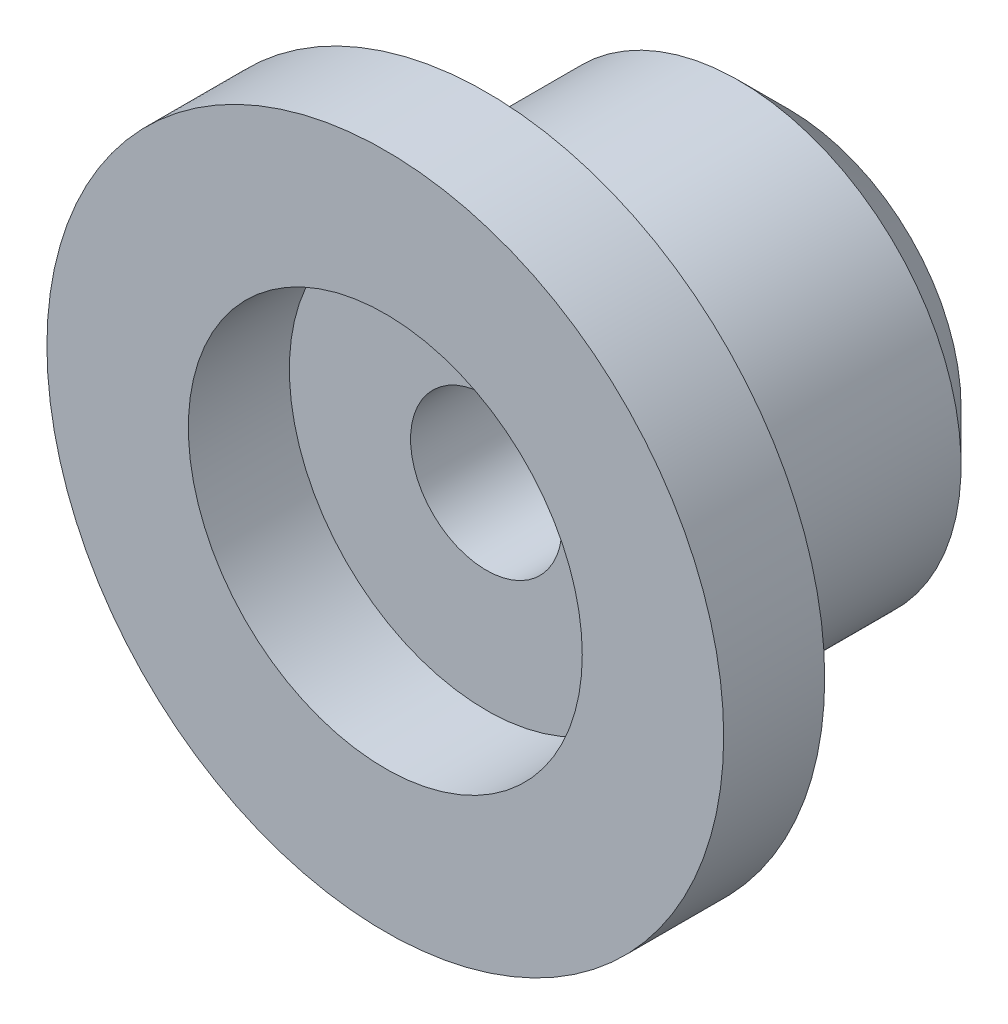
ISO-10303-21;
HEADER;
FILE_DESCRIPTION(('STEP AP214'),'2;1');
FILE_NAME('part.step','',(''),(''),'','','');
FILE_SCHEMA(('AUTOMOTIVE_DESIGN { 1 0 10303 214 1 1 1 1 }'));
ENDSEC;
DATA;
#1=APPLICATION_CONTEXT('core data for automotive mechanical design processes');
#2=APPLICATION_PROTOCOL_DEFINITION('international standard','automotive_design',2000,#1);
#3=PRODUCT_CONTEXT('',#1,'mechanical');
#4=PRODUCT('Part','Part','',(#3));
#5=PRODUCT_RELATED_PRODUCT_CATEGORY('part','',(#4));
#6=PRODUCT_DEFINITION_FORMATION('','',#4);
#7=PRODUCT_DEFINITION_CONTEXT('part definition',#1,'design');
#8=PRODUCT_DEFINITION('design','',#6,#7);
#9=PRODUCT_DEFINITION_SHAPE('','',#8);
#10=(LENGTH_UNIT() NAMED_UNIT(*) SI_UNIT(.MILLI.,.METRE.));
#11=(NAMED_UNIT(*) PLANE_ANGLE_UNIT() SI_UNIT($,.RADIAN.));
#12=(NAMED_UNIT(*) SI_UNIT($,.STERADIAN.) SOLID_ANGLE_UNIT());
#13=UNCERTAINTY_MEASURE_WITH_UNIT(LENGTH_MEASURE(1.E-05),#10,'distance_accuracy_value','');
#14=(GEOMETRIC_REPRESENTATION_CONTEXT(3) GLOBAL_UNCERTAINTY_ASSIGNED_CONTEXT((#13)) GLOBAL_UNIT_ASSIGNED_CONTEXT((#10,
#11,#12)) REPRESENTATION_CONTEXT('',''));
#15=CARTESIAN_POINT('',(0.,0.,0.));
#16=DIRECTION('',(0.,0.,1.));
#17=DIRECTION('',(1.,0.,0.));
#18=AXIS2_PLACEMENT_3D('',#15,#16,#17);
#19=CARTESIAN_POINT('',(-126.049999999161,-3.05000000000037,0.));
#20=DIRECTION('',(0.,0.,1.));
#21=DIRECTION('',(1.,0.,0.));
#22=AXIS2_PLACEMENT_3D('',#19,#20,#21);
#23=PLANE('',#22);
#24=CARTESIAN_POINT('',(-126.049999999161,-3.05000000000037,0.));
#25=DIRECTION('',(0.,0.,1.));
#26=DIRECTION('',(1.,0.,0.));
#27=AXIS2_PLACEMENT_3D('',#24,#25,#26);
#28=CIRCLE('',#27,1.95);
#29=CARTESIAN_POINT('',(-124.099999999161,-3.05000000000037,0.));
#30=VERTEX_POINT('',#29);
#31=EDGE_CURVE('E64',#30,#30,#28,.T.);
#32=ORIENTED_EDGE('',*,*,#31,.F.);
#33=EDGE_LOOP('',(#32));
#34=FACE_BOUND('',#33,.T.);
#35=CARTESIAN_POINT('',(-126.049999999161,-3.05000000000037,0.));
#36=DIRECTION('',(0.,0.,1.));
#37=DIRECTION('',(1.,0.,0.));
#38=AXIS2_PLACEMENT_3D('',#35,#36,#37);
#39=CIRCLE('',#38,3.34999999999998);
#40=CARTESIAN_POINT('',(-122.699999999161,-3.05000000000037,0.));
#41=VERTEX_POINT('',#40);
#42=EDGE_CURVE('E58',#41,#41,#39,.T.);
#43=ORIENTED_EDGE('',*,*,#42,.T.);
#44=EDGE_LOOP('',(#43));
#45=FACE_BOUND('',#44,.T.);
#46=ADVANCED_FACE('F39',(#34,#45),#23,.T.);
#47=CARTESIAN_POINT('',(-126.049999999161,-3.05000000000037,-1.));
#48=DIRECTION('',(0.,0.,1.));
#49=DIRECTION('',(0.,1.,0.));
#50=AXIS2_PLACEMENT_3D('',#47,#48,#49);
#51=PLANE('',#50);
#52=CARTESIAN_POINT('',(-126.049999999161,-3.05000000000037,-1.));
#53=DIRECTION('',(0.,0.,-1.));
#54=DIRECTION('',(-1.,0.,0.));
#55=AXIS2_PLACEMENT_3D('',#52,#53,#54);
#56=CIRCLE('',#55,2.20000000000001);
#57=CARTESIAN_POINT('',(-128.249999999161,-3.05000000000037,-1.));
#58=VERTEX_POINT('',#57);
#59=EDGE_CURVE('E51',#58,#58,#56,.T.);
#60=ORIENTED_EDGE('',*,*,#59,.F.);
#61=EDGE_LOOP('',(#60));
#62=FACE_BOUND('',#61,.T.);
#63=CARTESIAN_POINT('',(-126.049999999161,-3.05000000000037,-1.));
#64=DIRECTION('',(0.,0.,1.));
#65=DIRECTION('',(1.,0.,0.));
#66=AXIS2_PLACEMENT_3D('',#63,#64,#65);
#67=CIRCLE('',#66,3.34999999999998);
#68=CARTESIAN_POINT('',(-122.699999999161,-3.05000000000037,-1.));
#69=VERTEX_POINT('',#68);
#70=EDGE_CURVE('E55',#69,#69,#67,.F.);
#71=ORIENTED_EDGE('',*,*,#70,.T.);
#72=EDGE_LOOP('',(#71));
#73=FACE_BOUND('',#72,.T.);
#74=ADVANCED_FACE('F94',(#62,#73),#51,.F.);
#75=CARTESIAN_POINT('',(-126.049999999161,-3.05000000000037,-12.4463682658377));
#76=DIRECTION('',(0.,0.,1.));
#77=DIRECTION('',(1.,0.,0.));
#78=AXIS2_PLACEMENT_3D('',#75,#76,#77);
#79=CYLINDRICAL_SURFACE('',#78,3.34999999999998);
#80=ORIENTED_EDGE('',*,*,#42,.F.);
#81=EDGE_LOOP('',(#80));
#82=FACE_BOUND('',#81,.T.);
#83=ORIENTED_EDGE('',*,*,#70,.F.);
#84=EDGE_LOOP('',(#83));
#85=FACE_BOUND('',#84,.T.);
#86=ADVANCED_FACE('F98',(#82,#85),#79,.T.);
#87=CARTESIAN_POINT('',(-126.049999999161,-3.05000000000037,-4.));
#88=DIRECTION('',(0.,0.,1.));
#89=DIRECTION('',(1.,0.,0.));
#90=AXIS2_PLACEMENT_3D('',#87,#88,#89);
#91=CYLINDRICAL_SURFACE('',#90,2.20000000000001);
#92=CARTESIAN_POINT('',(-126.049999999161,-3.05000000000037,-3.5));
#93=DIRECTION('',(0.,0.,-1.));
#94=DIRECTION('',(-1.,0.,0.));
#95=AXIS2_PLACEMENT_3D('',#92,#93,#94);
#96=CIRCLE('',#95,2.20000000000001);
#97=CARTESIAN_POINT('',(-128.249999999161,-3.05000000000037,-3.5));
#98=VERTEX_POINT('',#97);
#99=EDGE_CURVE('E11',#98,#98,#96,.F.);
#100=ORIENTED_EDGE('',*,*,#99,.T.);
#101=EDGE_LOOP('',(#100));
#102=FACE_BOUND('',#101,.T.);
#103=ORIENTED_EDGE('',*,*,#59,.T.);
#104=EDGE_LOOP('',(#103));
#105=FACE_BOUND('',#104,.T.);
#106=ADVANCED_FACE('F101',(#102,#105),#91,.T.);
#107=CARTESIAN_POINT('',(-126.049999999161,-3.05000000000037,-4.));
#108=DIRECTION('',(0.,0.,-1.));
#109=DIRECTION('',(-1.,0.,0.));
#110=AXIS2_PLACEMENT_3D('',#107,#108,#109);
#111=PLANE('',#110);
#112=CARTESIAN_POINT('',(-126.049999999161,-3.05000000000037,-4.));
#113=DIRECTION('',(0.,0.,-1.));
#114=DIRECTION('',(-1.,0.,0.));
#115=AXIS2_PLACEMENT_3D('',#112,#113,#114);
#116=CIRCLE('',#115,1.70000000000001);
#117=CARTESIAN_POINT('',(-127.749999999161,-3.05000000000037,-4.));
#118=VERTEX_POINT('',#117);
#119=EDGE_CURVE('E47',#118,#118,#116,.T.);
#120=ORIENTED_EDGE('',*,*,#119,.T.);
#121=EDGE_LOOP('',(#120));
#122=FACE_BOUND('',#121,.T.);
#123=ADVANCED_FACE('F113',(#122),#111,.T.);
#124=CARTESIAN_POINT('',(-126.049999999161,-3.05000000000037,-4.));
#125=DIRECTION('',(0.,0.,1.));
#126=DIRECTION('',(1.,0.,0.));
#127=AXIS2_PLACEMENT_3D('',#124,#125,#126);
#128=CONICAL_SURFACE('',#127,1.70000000000001,0.785398163397449);
#129=ORIENTED_EDGE('',*,*,#99,.F.);
#130=EDGE_LOOP('',(#129));
#131=FACE_BOUND('',#130,.T.);
#132=ORIENTED_EDGE('',*,*,#119,.F.);
#133=EDGE_LOOP('',(#132));
#134=FACE_BOUND('',#133,.T.);
#135=ADVANCED_FACE('F42',(#131,#134),#128,.T.);
#136=CARTESIAN_POINT('',(-126.049999999161,-3.05000000000037,-1.));
#137=DIRECTION('',(0.,0.,1.));
#138=DIRECTION('',(1.,0.,0.));
#139=AXIS2_PLACEMENT_3D('',#136,#137,#138);
#140=CYLINDRICAL_SURFACE('',#139,1.95);
#141=CARTESIAN_POINT('',(-126.049999999161,-3.05000000000037,-1.));
#142=DIRECTION('',(0.,0.,1.));
#143=DIRECTION('',(1.,0.,0.));
#144=AXIS2_PLACEMENT_3D('',#141,#142,#143);
#145=CIRCLE('',#144,1.95);
#146=CARTESIAN_POINT('',(-124.099999999161,-3.05000000000037,-1.));
#147=VERTEX_POINT('',#146);
#148=EDGE_CURVE('E61',#147,#147,#145,.T.);
#149=ORIENTED_EDGE('',*,*,#148,.F.);
#150=EDGE_LOOP('',(#149));
#151=FACE_BOUND('',#150,.T.);
#152=ORIENTED_EDGE('',*,*,#31,.T.);
#153=EDGE_LOOP('',(#152));
#154=FACE_BOUND('',#153,.T.);
#155=ADVANCED_FACE('F83',(#151,#154),#140,.F.);
#156=CARTESIAN_POINT('',(-126.049999999161,-3.05000000000037,-1.));
#157=DIRECTION('',(0.,0.,1.));
#158=DIRECTION('',(1.,0.,0.));
#159=AXIS2_PLACEMENT_3D('',#156,#157,#158);
#160=PLANE('',#159);
#161=CARTESIAN_POINT('',(-126.049999999161,-3.05000000000037,-1.));
#162=DIRECTION('',(0.,0.,1.));
#163=DIRECTION('',(1.,0.,0.));
#164=AXIS2_PLACEMENT_3D('',#161,#162,#163);
#165=CIRCLE('',#164,0.750000000000012);
#166=CARTESIAN_POINT('',(-125.299999999161,-3.05000000000037,-1.));
#167=VERTEX_POINT('',#166);
#168=EDGE_CURVE('E72',#167,#167,#165,.T.);
#169=ORIENTED_EDGE('',*,*,#168,.F.);
#170=EDGE_LOOP('',(#169));
#171=FACE_BOUND('',#170,.T.);
#172=ORIENTED_EDGE('',*,*,#148,.T.);
#173=EDGE_LOOP('',(#172));
#174=FACE_BOUND('',#173,.T.);
#175=ADVANCED_FACE('F79',(#171,#174),#160,.T.);
#176=CARTESIAN_POINT('',(-126.049999999161,-3.05000000000037,-3.5));
#177=DIRECTION('',(0.,0.,-1.));
#178=DIRECTION('',(-1.,0.,0.));
#179=AXIS2_PLACEMENT_3D('',#176,#177,#178);
#180=PLANE('',#179);
#181=CARTESIAN_POINT('',(-126.049999999161,-3.05000000000037,-3.5));
#182=DIRECTION('',(0.,0.,-1.));
#183=DIRECTION('',(-1.,0.,0.));
#184=AXIS2_PLACEMENT_3D('',#181,#182,#183);
#185=CIRCLE('',#184,0.750000000000012);
#186=CARTESIAN_POINT('',(-126.799999999161,-3.05000000000037,-3.5));
#187=VERTEX_POINT('',#186);
#188=EDGE_CURVE('E67',#187,#187,#185,.F.);
#189=ORIENTED_EDGE('',*,*,#188,.T.);
#190=EDGE_LOOP('',(#189));
#191=FACE_BOUND('',#190,.T.);
#192=ADVANCED_FACE('F82',(#191),#180,.F.);
#193=CARTESIAN_POINT('',(-126.049999999161,-3.05000000000037,-6.12132034355966));
#194=DIRECTION('',(0.,0.,1.));
#195=DIRECTION('',(1.,0.,0.));
#196=AXIS2_PLACEMENT_3D('',#193,#194,#195);
#197=CYLINDRICAL_SURFACE('',#196,0.750000000000012);
#198=ORIENTED_EDGE('',*,*,#168,.T.);
#199=EDGE_LOOP('',(#198));
#200=FACE_BOUND('',#199,.T.);
#201=ORIENTED_EDGE('',*,*,#188,.F.);
#202=EDGE_LOOP('',(#201));
#203=FACE_BOUND('',#202,.T.);
#204=ADVANCED_FACE('F76',(#200,#203),#197,.F.);
#205=CLOSED_SHELL('',(#46,#74,#86,#106,#123,#135,#155,#175,#192,#204));
#206=MANIFOLD_SOLID_BREP('B2',#205);
#207=ADVANCED_BREP_SHAPE_REPRESENTATION('',(#18,#206),#14);
#208=SHAPE_DEFINITION_REPRESENTATION(#9,#207);
ENDSEC;
END-ISO-10303-21;
